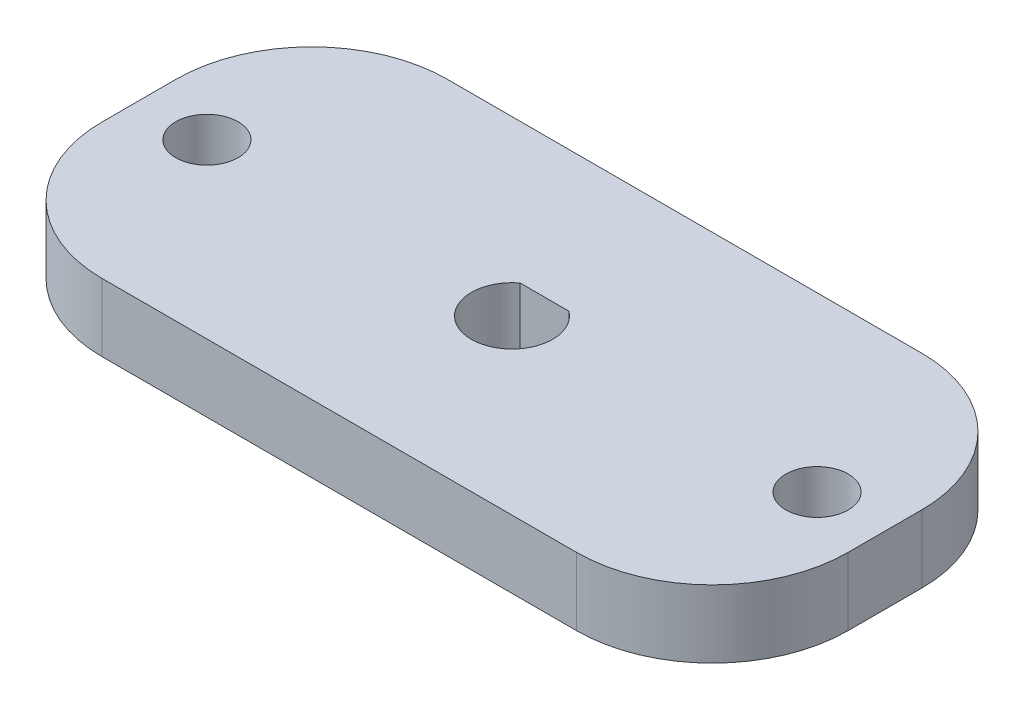
ISO-10303-21;
HEADER;
FILE_DESCRIPTION(('STEP AP214'),'2;1');
FILE_NAME('part.step','',(''),(''),'','','');
FILE_SCHEMA(('AUTOMOTIVE_DESIGN { 1 0 10303 214 1 1 1 1 }'));
ENDSEC;
DATA;
#1=APPLICATION_CONTEXT('core data for automotive mechanical design processes');
#2=APPLICATION_PROTOCOL_DEFINITION('international standard','automotive_design',2000,#1);
#3=PRODUCT_CONTEXT('',#1,'mechanical');
#4=PRODUCT('Part','Part','',(#3));
#5=PRODUCT_RELATED_PRODUCT_CATEGORY('part','',(#4));
#6=PRODUCT_DEFINITION_FORMATION('','',#4);
#7=PRODUCT_DEFINITION_CONTEXT('part definition',#1,'design');
#8=PRODUCT_DEFINITION('design','',#6,#7);
#9=PRODUCT_DEFINITION_SHAPE('','',#8);
#10=(LENGTH_UNIT() NAMED_UNIT(*) SI_UNIT(.MILLI.,.METRE.));
#11=(NAMED_UNIT(*) PLANE_ANGLE_UNIT() SI_UNIT($,.RADIAN.));
#12=(NAMED_UNIT(*) SI_UNIT($,.STERADIAN.) SOLID_ANGLE_UNIT());
#13=UNCERTAINTY_MEASURE_WITH_UNIT(LENGTH_MEASURE(1.E-05),#10,'distance_accuracy_value','');
#14=(GEOMETRIC_REPRESENTATION_CONTEXT(3) GLOBAL_UNCERTAINTY_ASSIGNED_CONTEXT((#13)) GLOBAL_UNIT_ASSIGNED_CONTEXT((#10,
#11,#12)) REPRESENTATION_CONTEXT('',''));
#15=CARTESIAN_POINT('',(0.,0.,0.));
#16=DIRECTION('',(0.,0.,1.));
#17=DIRECTION('',(1.,0.,0.));
#18=AXIS2_PLACEMENT_3D('',#15,#16,#17);
#19=CARTESIAN_POINT('',(17.5,5.,-2.72606382978725));
#20=DIRECTION('',(0.,-1.,0.));
#21=DIRECTION('',(0.,0.,-1.));
#22=AXIS2_PLACEMENT_3D('',#19,#20,#21);
#23=PLANE('',#22);
#24=CARTESIAN_POINT('',(22.5,5.,0.));
#25=DIRECTION('',(0.,1.,0.));
#26=DIRECTION('',(0.,0.,-1.));
#27=AXIS2_PLACEMENT_3D('',#24,#25,#26);
#28=CIRCLE('',#27,2.3);
#29=CARTESIAN_POINT('',(22.5,5.,-2.3));
#30=VERTEX_POINT('',#29);
#31=EDGE_CURVE('E145',#30,#30,#28,.T.);
#32=ORIENTED_EDGE('',*,*,#31,.F.);
#33=EDGE_LOOP('',(#32));
#34=FACE_BOUND('',#33,.T.);
#35=CARTESIAN_POINT('',(-22.5,5.,0.));
#36=DIRECTION('',(0.,1.,0.));
#37=DIRECTION('',(0.,0.,1.));
#38=AXIS2_PLACEMENT_3D('',#35,#36,#37);
#39=CIRCLE('',#38,2.3);
#40=CARTESIAN_POINT('',(-22.5,5.,2.3));
#41=VERTEX_POINT('',#40);
#42=EDGE_CURVE('E153',#41,#41,#39,.T.);
#43=ORIENTED_EDGE('',*,*,#42,.F.);
#44=EDGE_LOOP('',(#43));
#45=FACE_BOUND('',#44,.T.);
#46=CARTESIAN_POINT('',(17.5,5.,-2.72606382978725));
#47=DIRECTION('',(0.,1.,0.));
#48=DIRECTION('',(0.,0.,-1.));
#49=AXIS2_PLACEMENT_3D('',#46,#47,#48);
#50=CIRCLE('',#49,10.);
#51=CARTESIAN_POINT('',(27.5,5.,-2.72606382978717));
#52=VERTEX_POINT('',#51);
#53=CARTESIAN_POINT('',(17.4999999999999,5.,-12.7260638297872));
#54=VERTEX_POINT('',#53);
#55=EDGE_CURVE('E161',#52,#54,#50,.T.);
#56=ORIENTED_EDGE('',*,*,#55,.T.);
#57=DIRECTION('',(-1.,0.,0.));
#58=VECTOR('',#57,1.);
#59=CARTESIAN_POINT('',(-17.4999999999999,5.,-12.7260638297872));
#60=LINE('',#59,#58);
#61=CARTESIAN_POINT('',(-17.4999999999999,5.,-12.7260638297872));
#62=VERTEX_POINT('',#61);
#63=EDGE_CURVE('E165',#54,#62,#60,.T.);
#64=ORIENTED_EDGE('',*,*,#63,.T.);
#65=CARTESIAN_POINT('',(-17.5,5.,-2.72606382978725));
#66=DIRECTION('',(0.,1.,0.));
#67=DIRECTION('',(0.,0.,-1.));
#68=AXIS2_PLACEMENT_3D('',#65,#66,#67);
#69=CIRCLE('',#68,10.);
#70=CARTESIAN_POINT('',(-27.5,5.,-2.72606382978717));
#71=VERTEX_POINT('',#70);
#72=EDGE_CURVE('E169',#62,#71,#69,.T.);
#73=ORIENTED_EDGE('',*,*,#72,.T.);
#74=DIRECTION('',(0.,0.,1.));
#75=VECTOR('',#74,1.);
#76=CARTESIAN_POINT('',(-27.5,5.,2.72606382978717));
#77=LINE('',#76,#75);
#78=CARTESIAN_POINT('',(-27.5,5.,2.72606382978717));
#79=VERTEX_POINT('',#78);
#80=EDGE_CURVE('E172',#71,#79,#77,.T.);
#81=ORIENTED_EDGE('',*,*,#80,.T.);
#82=CARTESIAN_POINT('',(-17.5,5.,2.72606382978725));
#83=DIRECTION('',(0.,1.,0.));
#84=DIRECTION('',(0.,0.,-1.));
#85=AXIS2_PLACEMENT_3D('',#82,#83,#84);
#86=CIRCLE('',#85,10.);
#87=CARTESIAN_POINT('',(-17.4999999999999,5.,12.7260638297872));
#88=VERTEX_POINT('',#87);
#89=EDGE_CURVE('E175',#79,#88,#86,.T.);
#90=ORIENTED_EDGE('',*,*,#89,.T.);
#91=DIRECTION('',(1.,0.,0.));
#92=VECTOR('',#91,1.);
#93=CARTESIAN_POINT('',(-17.4999999999999,5.,12.7260638297872));
#94=LINE('',#93,#92);
#95=CARTESIAN_POINT('',(17.4999999999999,5.,12.7260638297872));
#96=VERTEX_POINT('',#95);
#97=EDGE_CURVE('E178',#88,#96,#94,.T.);
#98=ORIENTED_EDGE('',*,*,#97,.T.);
#99=CARTESIAN_POINT('',(17.5,5.,2.72606382978725));
#100=DIRECTION('',(0.,1.,0.));
#101=DIRECTION('',(0.,0.,1.));
#102=AXIS2_PLACEMENT_3D('',#99,#100,#101);
#103=CIRCLE('',#102,10.);
#104=CARTESIAN_POINT('',(27.5,5.,2.72606382978717));
#105=VERTEX_POINT('',#104);
#106=EDGE_CURVE('E181',#96,#105,#103,.T.);
#107=ORIENTED_EDGE('',*,*,#106,.T.);
#108=DIRECTION('',(0.,0.,-1.));
#109=VECTOR('',#108,1.);
#110=CARTESIAN_POINT('',(27.5,5.,2.72606382978717));
#111=LINE('',#110,#109);
#112=EDGE_CURVE('E184',#105,#52,#111,.T.);
#113=ORIENTED_EDGE('',*,*,#112,.T.);
#114=EDGE_LOOP('',(#56,#64,#73,#81,#90,#98,#107,#113));
#115=FACE_BOUND('',#114,.T.);
#116=CARTESIAN_POINT('',(0.,5.,0.));
#117=DIRECTION('',(0.,1.,0.));
#118=DIRECTION('',(0.,0.,1.));
#119=AXIS2_PLACEMENT_3D('',#116,#117,#118);
#120=CIRCLE('',#119,3.);
#121=CARTESIAN_POINT('',(-1.8,5.,-2.4));
#122=VERTEX_POINT('',#121);
#123=CARTESIAN_POINT('',(1.8,5.,-2.4));
#124=VERTEX_POINT('',#123);
#125=EDGE_CURVE('E129',#122,#124,#120,.T.);
#126=ORIENTED_EDGE('',*,*,#125,.F.);
#127=DIRECTION('',(-1.,0.,0.));
#128=VECTOR('',#127,1.);
#129=CARTESIAN_POINT('',(-1.8,5.,-2.4));
#130=LINE('',#129,#128);
#131=EDGE_CURVE('E122',#124,#122,#130,.T.);
#132=ORIENTED_EDGE('',*,*,#131,.F.);
#133=EDGE_LOOP('',(#126,#132));
#134=FACE_BOUND('',#133,.T.);
#135=ADVANCED_FACE('F45',(#34,#45,#115,#134),#23,.F.);
#136=CARTESIAN_POINT('',(17.5,0.,-2.72606382978725));
#137=DIRECTION('',(0.,-1.,0.));
#138=DIRECTION('',(0.,0.,-1.));
#139=AXIS2_PLACEMENT_3D('',#136,#137,#138);
#140=PLANE('',#139);
#141=CARTESIAN_POINT('',(-22.5,0.,0.));
#142=DIRECTION('',(0.,1.,0.));
#143=DIRECTION('',(0.,0.,1.));
#144=AXIS2_PLACEMENT_3D('',#141,#142,#143);
#145=CIRCLE('',#144,2.3);
#146=CARTESIAN_POINT('',(-22.5,0.,2.3));
#147=VERTEX_POINT('',#146);
#148=EDGE_CURVE('E149',#147,#147,#145,.T.);
#149=ORIENTED_EDGE('',*,*,#148,.T.);
#150=EDGE_LOOP('',(#149));
#151=FACE_BOUND('',#150,.T.);
#152=CARTESIAN_POINT('',(17.5,0.,-2.72606382978725));
#153=DIRECTION('',(0.,1.,0.));
#154=DIRECTION('',(0.,0.,-1.));
#155=AXIS2_PLACEMENT_3D('',#152,#153,#154);
#156=CIRCLE('',#155,10.);
#157=CARTESIAN_POINT('',(27.5,0.,-2.72606382978717));
#158=VERTEX_POINT('',#157);
#159=CARTESIAN_POINT('',(17.4999999999999,0.,-12.7260638297872));
#160=VERTEX_POINT('',#159);
#161=EDGE_CURVE('E157',#158,#160,#156,.T.);
#162=ORIENTED_EDGE('',*,*,#161,.F.);
#163=DIRECTION('',(0.,0.,-1.));
#164=VECTOR('',#163,1.);
#165=CARTESIAN_POINT('',(27.5,0.,2.72606382978717));
#166=LINE('',#165,#164);
#167=CARTESIAN_POINT('',(27.5,0.,2.72606382978717));
#168=VERTEX_POINT('',#167);
#169=EDGE_CURVE('E166',#168,#158,#166,.T.);
#170=ORIENTED_EDGE('',*,*,#169,.F.);
#171=CARTESIAN_POINT('',(17.5,0.,2.72606382978725));
#172=DIRECTION('',(0.,1.,0.));
#173=DIRECTION('',(0.,0.,1.));
#174=AXIS2_PLACEMENT_3D('',#171,#172,#173);
#175=CIRCLE('',#174,10.);
#176=CARTESIAN_POINT('',(17.4999999999999,0.,12.7260638297872));
#177=VERTEX_POINT('',#176);
#178=EDGE_CURVE('E206',#177,#168,#175,.T.);
#179=ORIENTED_EDGE('',*,*,#178,.F.);
#180=DIRECTION('',(1.,0.,0.));
#181=VECTOR('',#180,1.);
#182=CARTESIAN_POINT('',(-17.4999999999999,0.,12.7260638297872));
#183=LINE('',#182,#181);
#184=CARTESIAN_POINT('',(-17.4999999999999,0.,12.7260638297872));
#185=VERTEX_POINT('',#184);
#186=EDGE_CURVE('E203',#185,#177,#183,.T.);
#187=ORIENTED_EDGE('',*,*,#186,.F.);
#188=CARTESIAN_POINT('',(-17.5,0.,2.72606382978725));
#189=DIRECTION('',(0.,1.,0.));
#190=DIRECTION('',(0.,0.,-1.));
#191=AXIS2_PLACEMENT_3D('',#188,#189,#190);
#192=CIRCLE('',#191,10.);
#193=CARTESIAN_POINT('',(-27.5,0.,2.72606382978717));
#194=VERTEX_POINT('',#193);
#195=EDGE_CURVE('E200',#194,#185,#192,.T.);
#196=ORIENTED_EDGE('',*,*,#195,.F.);
#197=DIRECTION('',(0.,0.,1.));
#198=VECTOR('',#197,1.);
#199=CARTESIAN_POINT('',(-27.5,0.,2.72606382978717));
#200=LINE('',#199,#198);
#201=CARTESIAN_POINT('',(-27.5,0.,-2.72606382978717));
#202=VERTEX_POINT('',#201);
#203=EDGE_CURVE('E197',#202,#194,#200,.T.);
#204=ORIENTED_EDGE('',*,*,#203,.F.);
#205=CARTESIAN_POINT('',(-17.5,0.,-2.72606382978725));
#206=DIRECTION('',(0.,1.,0.));
#207=DIRECTION('',(0.,0.,-1.));
#208=AXIS2_PLACEMENT_3D('',#205,#206,#207);
#209=CIRCLE('',#208,10.);
#210=CARTESIAN_POINT('',(-17.4999999999999,0.,-12.7260638297872));
#211=VERTEX_POINT('',#210);
#212=EDGE_CURVE('E194',#211,#202,#209,.T.);
#213=ORIENTED_EDGE('',*,*,#212,.F.);
#214=DIRECTION('',(-1.,0.,0.));
#215=VECTOR('',#214,1.);
#216=CARTESIAN_POINT('',(-17.4999999999999,0.,-12.7260638297872));
#217=LINE('',#216,#215);
#218=EDGE_CURVE('E191',#160,#211,#217,.T.);
#219=ORIENTED_EDGE('',*,*,#218,.F.);
#220=EDGE_LOOP('',(#162,#170,#179,#187,#196,#204,#213,#219));
#221=FACE_BOUND('',#220,.T.);
#222=CARTESIAN_POINT('',(22.5,0.,0.));
#223=DIRECTION('',(0.,1.,0.));
#224=DIRECTION('',(0.,0.,-1.));
#225=AXIS2_PLACEMENT_3D('',#222,#223,#224);
#226=CIRCLE('',#225,2.3);
#227=CARTESIAN_POINT('',(22.5,0.,-2.3));
#228=VERTEX_POINT('',#227);
#229=EDGE_CURVE('E144',#228,#228,#226,.T.);
#230=ORIENTED_EDGE('',*,*,#229,.T.);
#231=EDGE_LOOP('',(#230));
#232=FACE_BOUND('',#231,.T.);
#233=DIRECTION('',(-1.,0.,0.));
#234=VECTOR('',#233,1.);
#235=CARTESIAN_POINT('',(-1.8,0.,-2.4));
#236=LINE('',#235,#234);
#237=CARTESIAN_POINT('',(1.8,0.,-2.4));
#238=VERTEX_POINT('',#237);
#239=CARTESIAN_POINT('',(-1.8,0.,-2.4));
#240=VERTEX_POINT('',#239);
#241=EDGE_CURVE('E135',#238,#240,#236,.T.);
#242=ORIENTED_EDGE('',*,*,#241,.T.);
#243=CARTESIAN_POINT('',(0.,0.,0.));
#244=DIRECTION('',(0.,1.,0.));
#245=DIRECTION('',(0.,0.,1.));
#246=AXIS2_PLACEMENT_3D('',#243,#244,#245);
#247=CIRCLE('',#246,3.);
#248=EDGE_CURVE('E68',#240,#238,#247,.T.);
#249=ORIENTED_EDGE('',*,*,#248,.T.);
#250=EDGE_LOOP('',(#242,#249));
#251=FACE_BOUND('',#250,.T.);
#252=ADVANCED_FACE('F245',(#151,#221,#232,#251),#140,.T.);
#253=CARTESIAN_POINT('',(17.5,5.,-2.72606382978725));
#254=DIRECTION('',(0.,-1.,0.));
#255=DIRECTION('',(0.,0.,-1.));
#256=AXIS2_PLACEMENT_3D('',#253,#254,#255);
#257=CYLINDRICAL_SURFACE('',#256,10.);
#258=ORIENTED_EDGE('',*,*,#161,.T.);
#259=DIRECTION('',(0.,-1.,0.));
#260=VECTOR('',#259,1.);
#261=CARTESIAN_POINT('',(17.4999999999999,5.,-12.7260638297872));
#262=LINE('',#261,#260);
#263=EDGE_CURVE('E11',#54,#160,#262,.T.);
#264=ORIENTED_EDGE('',*,*,#263,.F.);
#265=ORIENTED_EDGE('',*,*,#55,.F.);
#266=DIRECTION('',(0.,-1.,0.));
#267=VECTOR('',#266,1.);
#268=CARTESIAN_POINT('',(27.5,5.,-2.72606382978717));
#269=LINE('',#268,#267);
#270=EDGE_CURVE('E187',#52,#158,#269,.T.);
#271=ORIENTED_EDGE('',*,*,#270,.T.);
#272=EDGE_LOOP('',(#258,#264,#265,#271));
#273=FACE_BOUND('',#272,.T.);
#274=ADVANCED_FACE('F47',(#273),#257,.T.);
#275=CARTESIAN_POINT('',(-17.4999999999999,5.,-12.7260638297872));
#276=DIRECTION('',(0.,0.,1.));
#277=DIRECTION('',(1.,0.,0.));
#278=AXIS2_PLACEMENT_3D('',#275,#276,#277);
#279=PLANE('',#278);
#280=ORIENTED_EDGE('',*,*,#218,.T.);
#281=DIRECTION('',(0.,-1.,0.));
#282=VECTOR('',#281,1.);
#283=CARTESIAN_POINT('',(-17.4999999999999,5.,-12.7260638297872));
#284=LINE('',#283,#282);
#285=EDGE_CURVE('E54',#62,#211,#284,.T.);
#286=ORIENTED_EDGE('',*,*,#285,.F.);
#287=ORIENTED_EDGE('',*,*,#63,.F.);
#288=ORIENTED_EDGE('',*,*,#263,.T.);
#289=EDGE_LOOP('',(#280,#286,#287,#288));
#290=FACE_BOUND('',#289,.T.);
#291=ADVANCED_FACE('F262',(#290),#279,.F.);
#292=CARTESIAN_POINT('',(-17.5,5.,-2.72606382978725));
#293=DIRECTION('',(0.,-1.,0.));
#294=DIRECTION('',(0.,0.,-1.));
#295=AXIS2_PLACEMENT_3D('',#292,#293,#294);
#296=CYLINDRICAL_SURFACE('',#295,10.);
#297=ORIENTED_EDGE('',*,*,#212,.T.);
#298=DIRECTION('',(0.,-1.,0.));
#299=VECTOR('',#298,1.);
#300=CARTESIAN_POINT('',(-27.5,5.,-2.72606382978717));
#301=LINE('',#300,#299);
#302=EDGE_CURVE('E230',#71,#202,#301,.T.);
#303=ORIENTED_EDGE('',*,*,#302,.F.);
#304=ORIENTED_EDGE('',*,*,#72,.F.);
#305=ORIENTED_EDGE('',*,*,#285,.T.);
#306=EDGE_LOOP('',(#297,#303,#304,#305));
#307=FACE_BOUND('',#306,.T.);
#308=ADVANCED_FACE('F239',(#307),#296,.T.);
#309=CARTESIAN_POINT('',(-27.5,5.,2.72606382978717));
#310=DIRECTION('',(1.,0.,0.));
#311=DIRECTION('',(0.,0.,-1.));
#312=AXIS2_PLACEMENT_3D('',#309,#310,#311);
#313=PLANE('',#312);
#314=ORIENTED_EDGE('',*,*,#203,.T.);
#315=DIRECTION('',(0.,-1.,0.));
#316=VECTOR('',#315,1.);
#317=CARTESIAN_POINT('',(-27.5,5.,2.72606382978717));
#318=LINE('',#317,#316);
#319=EDGE_CURVE('E226',#79,#194,#318,.T.);
#320=ORIENTED_EDGE('',*,*,#319,.F.);
#321=ORIENTED_EDGE('',*,*,#80,.F.);
#322=ORIENTED_EDGE('',*,*,#302,.T.);
#323=EDGE_LOOP('',(#314,#320,#321,#322));
#324=FACE_BOUND('',#323,.T.);
#325=ADVANCED_FACE('F251',(#324),#313,.F.);
#326=CARTESIAN_POINT('',(-17.5,5.,2.72606382978725));
#327=DIRECTION('',(0.,-1.,0.));
#328=DIRECTION('',(0.,0.,-1.));
#329=AXIS2_PLACEMENT_3D('',#326,#327,#328);
#330=CYLINDRICAL_SURFACE('',#329,10.);
#331=ORIENTED_EDGE('',*,*,#195,.T.);
#332=DIRECTION('',(0.,-1.,0.));
#333=VECTOR('',#332,1.);
#334=CARTESIAN_POINT('',(-17.4999999999999,5.,12.7260638297872));
#335=LINE('',#334,#333);
#336=EDGE_CURVE('E222',#88,#185,#335,.T.);
#337=ORIENTED_EDGE('',*,*,#336,.F.);
#338=ORIENTED_EDGE('',*,*,#89,.F.);
#339=ORIENTED_EDGE('',*,*,#319,.T.);
#340=EDGE_LOOP('',(#331,#337,#338,#339));
#341=FACE_BOUND('',#340,.T.);
#342=ADVANCED_FACE('F255',(#341),#330,.T.);
#343=CARTESIAN_POINT('',(-17.4999999999999,5.,12.7260638297872));
#344=DIRECTION('',(0.,0.,-1.));
#345=DIRECTION('',(-1.,0.,0.));
#346=AXIS2_PLACEMENT_3D('',#343,#344,#345);
#347=PLANE('',#346);
#348=ORIENTED_EDGE('',*,*,#186,.T.);
#349=DIRECTION('',(0.,-1.,0.));
#350=VECTOR('',#349,1.);
#351=CARTESIAN_POINT('',(17.4999999999999,5.,12.7260638297872));
#352=LINE('',#351,#350);
#353=EDGE_CURVE('E218',#96,#177,#352,.T.);
#354=ORIENTED_EDGE('',*,*,#353,.F.);
#355=ORIENTED_EDGE('',*,*,#97,.F.);
#356=ORIENTED_EDGE('',*,*,#336,.T.);
#357=EDGE_LOOP('',(#348,#354,#355,#356));
#358=FACE_BOUND('',#357,.T.);
#359=ADVANCED_FACE('F275',(#358),#347,.F.);
#360=CARTESIAN_POINT('',(17.5,5.,2.72606382978725));
#361=DIRECTION('',(0.,-1.,0.));
#362=DIRECTION('',(0.,0.,-1.));
#363=AXIS2_PLACEMENT_3D('',#360,#361,#362);
#364=CYLINDRICAL_SURFACE('',#363,10.);
#365=ORIENTED_EDGE('',*,*,#178,.T.);
#366=DIRECTION('',(0.,-1.,0.));
#367=VECTOR('',#366,1.);
#368=CARTESIAN_POINT('',(27.5,5.,2.72606382978717));
#369=LINE('',#368,#367);
#370=EDGE_CURVE('E214',#105,#168,#369,.T.);
#371=ORIENTED_EDGE('',*,*,#370,.F.);
#372=ORIENTED_EDGE('',*,*,#106,.F.);
#373=ORIENTED_EDGE('',*,*,#353,.T.);
#374=EDGE_LOOP('',(#365,#371,#372,#373));
#375=FACE_BOUND('',#374,.T.);
#376=ADVANCED_FACE('F273',(#375),#364,.T.);
#377=CARTESIAN_POINT('',(27.5,5.,2.72606382978717));
#378=DIRECTION('',(-1.,0.,0.));
#379=DIRECTION('',(0.,0.,1.));
#380=AXIS2_PLACEMENT_3D('',#377,#378,#379);
#381=PLANE('',#380);
#382=ORIENTED_EDGE('',*,*,#169,.T.);
#383=ORIENTED_EDGE('',*,*,#270,.F.);
#384=ORIENTED_EDGE('',*,*,#112,.F.);
#385=ORIENTED_EDGE('',*,*,#370,.T.);
#386=EDGE_LOOP('',(#382,#383,#384,#385));
#387=FACE_BOUND('',#386,.T.);
#388=ADVANCED_FACE('F268',(#387),#381,.F.);
#389=CARTESIAN_POINT('',(-22.5,5.,0.));
#390=DIRECTION('',(0.,-1.,0.));
#391=DIRECTION('',(0.,0.,-1.));
#392=AXIS2_PLACEMENT_3D('',#389,#390,#391);
#393=CYLINDRICAL_SURFACE('',#392,2.3);
#394=ORIENTED_EDGE('',*,*,#42,.T.);
#395=EDGE_LOOP('',(#394));
#396=FACE_BOUND('',#395,.T.);
#397=ORIENTED_EDGE('',*,*,#148,.F.);
#398=EDGE_LOOP('',(#397));
#399=FACE_BOUND('',#398,.T.);
#400=ADVANCED_FACE('F295',(#396,#399),#393,.F.);
#401=CARTESIAN_POINT('',(22.5,5.,0.));
#402=DIRECTION('',(0.,-1.,0.));
#403=DIRECTION('',(0.,0.,-1.));
#404=AXIS2_PLACEMENT_3D('',#401,#402,#403);
#405=CYLINDRICAL_SURFACE('',#404,2.3);
#406=ORIENTED_EDGE('',*,*,#31,.T.);
#407=EDGE_LOOP('',(#406));
#408=FACE_BOUND('',#407,.T.);
#409=ORIENTED_EDGE('',*,*,#229,.F.);
#410=EDGE_LOOP('',(#409));
#411=FACE_BOUND('',#410,.T.);
#412=ADVANCED_FACE('F302',(#408,#411),#405,.F.);
#413=CARTESIAN_POINT('',(0.,5.,0.));
#414=DIRECTION('',(0.,-1.,0.));
#415=DIRECTION('',(0.,0.,-1.));
#416=AXIS2_PLACEMENT_3D('',#413,#414,#415);
#417=CYLINDRICAL_SURFACE('',#416,3.);
#418=ORIENTED_EDGE('',*,*,#248,.F.);
#419=DIRECTION('',(0.,-1.,0.));
#420=VECTOR('',#419,1.);
#421=CARTESIAN_POINT('',(-1.8,5.,-2.4));
#422=LINE('',#421,#420);
#423=EDGE_CURVE('E124',#122,#240,#422,.T.);
#424=ORIENTED_EDGE('',*,*,#423,.F.);
#425=ORIENTED_EDGE('',*,*,#125,.T.);
#426=DIRECTION('',(0.,-1.,0.));
#427=VECTOR('',#426,1.);
#428=CARTESIAN_POINT('',(1.8,5.,-2.4));
#429=LINE('',#428,#427);
#430=EDGE_CURVE('E61',#124,#238,#429,.T.);
#431=ORIENTED_EDGE('',*,*,#430,.T.);
#432=EDGE_LOOP('',(#418,#424,#425,#431));
#433=FACE_BOUND('',#432,.T.);
#434=ADVANCED_FACE('F131',(#433),#417,.F.);
#435=CARTESIAN_POINT('',(-1.8,5.,-2.4));
#436=DIRECTION('',(0.,0.,1.));
#437=DIRECTION('',(1.,0.,0.));
#438=AXIS2_PLACEMENT_3D('',#435,#436,#437);
#439=PLANE('',#438);
#440=ORIENTED_EDGE('',*,*,#241,.F.);
#441=ORIENTED_EDGE('',*,*,#430,.F.);
#442=ORIENTED_EDGE('',*,*,#131,.T.);
#443=ORIENTED_EDGE('',*,*,#423,.T.);
#444=EDGE_LOOP('',(#440,#441,#442,#443));
#445=FACE_BOUND('',#444,.T.);
#446=ADVANCED_FACE('F123',(#445),#439,.T.);
#447=CLOSED_SHELL('',(#135,#252,#274,#291,#308,#325,#342,#359,#376,#388,#400,#412,#434,#446));
#448=MANIFOLD_SOLID_BREP('B2',#447);
#449=ADVANCED_BREP_SHAPE_REPRESENTATION('',(#18,#448),#14);
#450=SHAPE_DEFINITION_REPRESENTATION(#9,#449);
ENDSEC;
END-ISO-10303-21;
